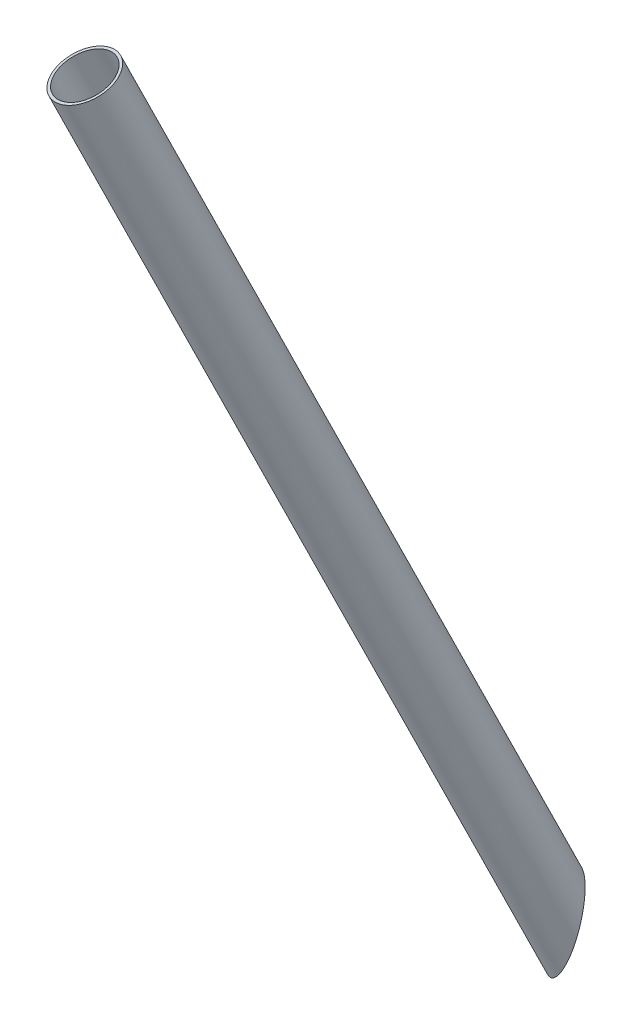
ISO-10303-21;
HEADER;
FILE_DESCRIPTION(('STEP AP214'),'2;1');
FILE_NAME('part.step','',(''),(''),'','','');
FILE_SCHEMA(('AUTOMOTIVE_DESIGN { 1 0 10303 214 1 1 1 1 }'));
ENDSEC;
DATA;
#1=APPLICATION_CONTEXT('core data for automotive mechanical design processes');
#2=APPLICATION_PROTOCOL_DEFINITION('international standard','automotive_design',2000,#1);
#3=PRODUCT_CONTEXT('',#1,'mechanical');
#4=PRODUCT('Part','Part','',(#3));
#5=PRODUCT_RELATED_PRODUCT_CATEGORY('part','',(#4));
#6=PRODUCT_DEFINITION_FORMATION('','',#4);
#7=PRODUCT_DEFINITION_CONTEXT('part definition',#1,'design');
#8=PRODUCT_DEFINITION('design','',#6,#7);
#9=PRODUCT_DEFINITION_SHAPE('','',#8);
#10=(LENGTH_UNIT() NAMED_UNIT(*) SI_UNIT(.MILLI.,.METRE.));
#11=(NAMED_UNIT(*) PLANE_ANGLE_UNIT() SI_UNIT($,.RADIAN.));
#12=(NAMED_UNIT(*) SI_UNIT($,.STERADIAN.) SOLID_ANGLE_UNIT());
#13=UNCERTAINTY_MEASURE_WITH_UNIT(LENGTH_MEASURE(1.E-05),#10,'distance_accuracy_value','');
#14=(GEOMETRIC_REPRESENTATION_CONTEXT(3) GLOBAL_UNCERTAINTY_ASSIGNED_CONTEXT((#13)) GLOBAL_UNIT_ASSIGNED_CONTEXT((#10,
#11,#12)) REPRESENTATION_CONTEXT('',''));
#15=CARTESIAN_POINT('',(0.,0.,0.));
#16=DIRECTION('',(0.,0.,1.));
#17=DIRECTION('',(1.,0.,0.));
#18=AXIS2_PLACEMENT_3D('',#15,#16,#17);
#19=CARTESIAN_POINT('',(-250.,0.,-1700.));
#20=DIRECTION('',(-0.214351342090107,0.914565726251124,0.342962147344171));
#21=DIRECTION('',(0.,-0.351123441588391,0.936329177569045));
#22=AXIS2_PLACEMENT_3D('',#19,#20,#21);
#23=CYLINDRICAL_SURFACE('',#22,11.3);
#24=CARTESIAN_POINT('',(-325.,320.,-1580.));
#25=DIRECTION('',(0.214351342090107,-0.914565726251124,-0.342962147344171));
#26=DIRECTION('',(0.620647271384696,-0.143596582877078,0.770828765620976));
#27=AXIS2_PLACEMENT_3D('',#24,#25,#26);
#28=CIRCLE('',#27,11.3);
#29=CARTESIAN_POINT('',(-317.986685833353,318.377358613489,-1571.28963494848));
#30=VERTEX_POINT('',#29);
#31=EDGE_CURVE('E47',#30,#30,#28,.T.);
#32=ORIENTED_EDGE('',*,*,#31,.F.);
#33=EDGE_LOOP('',(#32));
#34=FACE_BOUND('',#33,.T.);
#35=CARTESIAN_POINT('',(-245.901636204054,-17.4863521960367,-1706.55738207351));
#36=DIRECTION('',(0.490298311522791,-0.291983203687868,-0.821190218208954));
#37=DIRECTION('',(0.140336447675245,0.956366902675757,-0.25625773923976));
#38=AXIS2_PLACEMENT_3D('',#35,#36,#37);
#39=ELLIPSE('',#38,17.2843371793672,11.3);
#40=CARTESIAN_POINT('',(-243.47601372388,-0.956184183001866,-1710.98662724336));
#41=VERTEX_POINT('',#40);
#42=EDGE_CURVE('E43',#41,#41,#39,.T.);
#43=ORIENTED_EDGE('',*,*,#42,.T.);
#44=EDGE_LOOP('',(#43));
#45=FACE_BOUND('',#44,.T.);
#46=ADVANCED_FACE('F39',(#34,#45),#23,.F.);
#47=CARTESIAN_POINT('',(-250.,0.,-1700.));
#48=DIRECTION('',(-0.214351342090107,0.914565726251124,0.342962147344171));
#49=DIRECTION('',(0.,-0.351123441588391,0.936329177569045));
#50=AXIS2_PLACEMENT_3D('',#47,#48,#49);
#51=CYLINDRICAL_SURFACE('',#50,12.5);
#52=CARTESIAN_POINT('',(-325.,320.,-1580.));
#53=DIRECTION('',(0.214351342090107,-0.914565726251124,-0.342962147344171));
#54=DIRECTION('',(0.620647271384696,-0.143596582877078,0.770828765620976));
#55=AXIS2_PLACEMENT_3D('',#52,#53,#54);
#56=CIRCLE('',#55,12.5);
#57=CARTESIAN_POINT('',(-317.241909107691,318.205042714037,-1570.36464042974));
#58=VERTEX_POINT('',#57);
#59=EDGE_CURVE('E51',#58,#58,#56,.T.);
#60=ORIENTED_EDGE('',*,*,#59,.T.);
#61=EDGE_LOOP('',(#60));
#62=FACE_BOUND('',#61,.T.);
#63=CARTESIAN_POINT('',(-245.901636204054,-17.4863521960367,-1706.55738207351));
#64=DIRECTION('',(0.490298311522791,-0.291983203687868,-0.821190218208954));
#65=DIRECTION('',(0.140336447675245,0.956366902675757,-0.25625773923976));
#66=AXIS2_PLACEMENT_3D('',#63,#64,#65);
#67=ELLIPSE('',#66,19.1198420125744,12.5);
#68=CARTESIAN_POINT('',(-243.218425495897,0.799231889178853,-1711.45698956228));
#69=VERTEX_POINT('',#68);
#70=EDGE_CURVE('E10',#69,#69,#67,.T.);
#71=ORIENTED_EDGE('',*,*,#70,.F.);
#72=EDGE_LOOP('',(#71));
#73=FACE_BOUND('',#72,.T.);
#74=ADVANCED_FACE('F67',(#62,#73),#51,.T.);
#75=CARTESIAN_POINT('',(-325.,320.,-1580.));
#76=DIRECTION('',(0.214351342090107,-0.914565726251124,-0.342962147344171));
#77=DIRECTION('',(0.620647271384696,-0.143596582877078,0.770828765620976));
#78=AXIS2_PLACEMENT_3D('',#75,#76,#77);
#79=PLANE('',#78);
#80=ORIENTED_EDGE('',*,*,#31,.T.);
#81=EDGE_LOOP('',(#80));
#82=FACE_BOUND('',#81,.T.);
#83=ORIENTED_EDGE('',*,*,#59,.F.);
#84=EDGE_LOOP('',(#83));
#85=FACE_BOUND('',#84,.T.);
#86=ADVANCED_FACE('F62',(#82,#85),#79,.F.);
#87=CARTESIAN_POINT('',(-233.118994841351,-3.51979231141316,-1703.89136568805));
#88=DIRECTION('',(0.490298311522791,-0.291983203687868,-0.821190218208954));
#89=DIRECTION('',(-0.858605277115103,0.,-0.512637277331737));
#90=AXIS2_PLACEMENT_3D('',#87,#88,#89);
#91=PLANE('',#90);
#92=ORIENTED_EDGE('',*,*,#42,.F.);
#93=EDGE_LOOP('',(#92));
#94=FACE_BOUND('',#93,.T.);
#95=ORIENTED_EDGE('',*,*,#70,.T.);
#96=EDGE_LOOP('',(#95));
#97=FACE_BOUND('',#96,.T.);
#98=ADVANCED_FACE('F41',(#94,#97),#91,.T.);
#99=CLOSED_SHELL('',(#46,#74,#86,#98));
#100=MANIFOLD_SOLID_BREP('B2',#99);
#101=ADVANCED_BREP_SHAPE_REPRESENTATION('',(#18,#100),#14);
#102=SHAPE_DEFINITION_REPRESENTATION(#9,#101);
ENDSEC;
END-ISO-10303-21;
